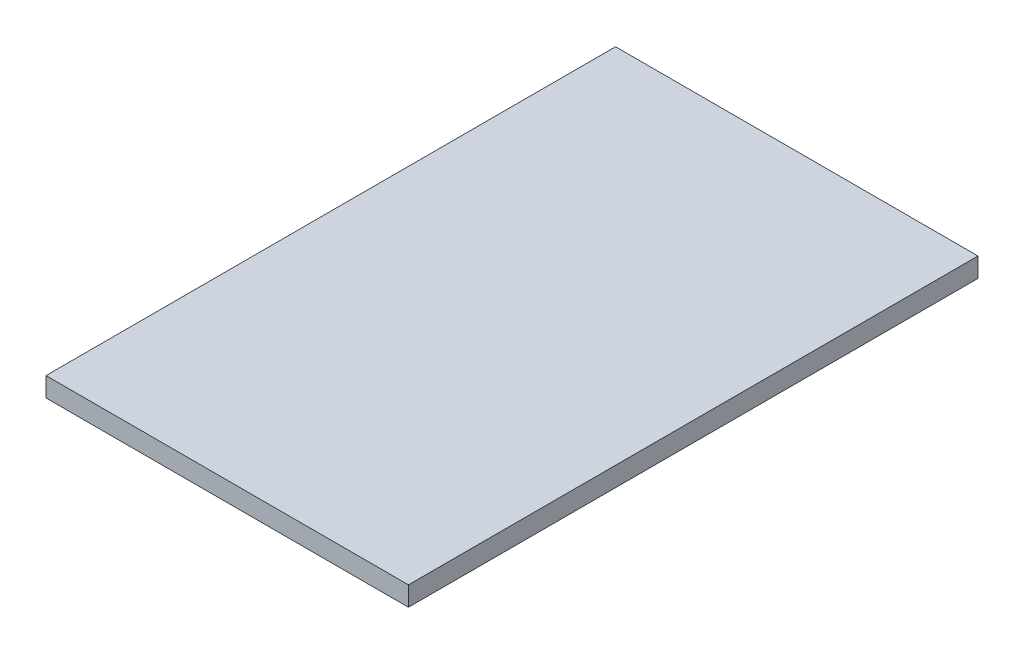
ISO-10303-21;
HEADER;
FILE_DESCRIPTION(('STEP AP214'),'2;1');
FILE_NAME('part.step','',(''),(''),'','','');
FILE_SCHEMA(('AUTOMOTIVE_DESIGN { 1 0 10303 214 1 1 1 1 }'));
ENDSEC;
DATA;
#1=APPLICATION_CONTEXT('core data for automotive mechanical design processes');
#2=APPLICATION_PROTOCOL_DEFINITION('international standard','automotive_design',2000,#1);
#3=PRODUCT_CONTEXT('',#1,'mechanical');
#4=PRODUCT('Part','Part','',(#3));
#5=PRODUCT_RELATED_PRODUCT_CATEGORY('part','',(#4));
#6=PRODUCT_DEFINITION_FORMATION('','',#4);
#7=PRODUCT_DEFINITION_CONTEXT('part definition',#1,'design');
#8=PRODUCT_DEFINITION('design','',#6,#7);
#9=PRODUCT_DEFINITION_SHAPE('','',#8);
#10=(LENGTH_UNIT() NAMED_UNIT(*) SI_UNIT(.MILLI.,.METRE.));
#11=(NAMED_UNIT(*) PLANE_ANGLE_UNIT() SI_UNIT($,.RADIAN.));
#12=(NAMED_UNIT(*) SI_UNIT($,.STERADIAN.) SOLID_ANGLE_UNIT());
#13=UNCERTAINTY_MEASURE_WITH_UNIT(LENGTH_MEASURE(1.E-05),#10,'distance_accuracy_value','');
#14=(GEOMETRIC_REPRESENTATION_CONTEXT(3) GLOBAL_UNCERTAINTY_ASSIGNED_CONTEXT((#13)) GLOBAL_UNIT_ASSIGNED_CONTEXT((#10,
#11,#12)) REPRESENTATION_CONTEXT('',''));
#15=CARTESIAN_POINT('',(0.,0.,0.));
#16=DIRECTION('',(0.,0.,1.));
#17=DIRECTION('',(1.,0.,0.));
#18=AXIS2_PLACEMENT_3D('',#15,#16,#17);
#19=CARTESIAN_POINT('',(-28.,3.,-44.));
#20=DIRECTION('',(1.,0.,0.));
#21=DIRECTION('',(0.,0.,-1.));
#22=AXIS2_PLACEMENT_3D('',#19,#20,#21);
#23=PLANE('',#22);
#24=DIRECTION('',(0.,0.,1.));
#25=VECTOR('',#24,1.);
#26=CARTESIAN_POINT('',(-28.,0.,-44.));
#27=LINE('',#26,#25);
#28=CARTESIAN_POINT('',(-28.,0.,-44.));
#29=VERTEX_POINT('',#28);
#30=CARTESIAN_POINT('',(-28.,0.,44.));
#31=VERTEX_POINT('',#30);
#32=EDGE_CURVE('E100',#29,#31,#27,.T.);
#33=ORIENTED_EDGE('',*,*,#32,.T.);
#34=DIRECTION('',(0.,-1.,0.));
#35=VECTOR('',#34,1.);
#36=CARTESIAN_POINT('',(-28.,3.,44.));
#37=LINE('',#36,#35);
#38=CARTESIAN_POINT('',(-28.,3.,44.));
#39=VERTEX_POINT('',#38);
#40=EDGE_CURVE('E11',#39,#31,#37,.T.);
#41=ORIENTED_EDGE('',*,*,#40,.F.);
#42=DIRECTION('',(0.,0.,1.));
#43=VECTOR('',#42,1.);
#44=CARTESIAN_POINT('',(-28.,3.,-44.));
#45=LINE('',#44,#43);
#46=CARTESIAN_POINT('',(-28.,3.,-44.));
#47=VERTEX_POINT('',#46);
#48=EDGE_CURVE('E88',#47,#39,#45,.T.);
#49=ORIENTED_EDGE('',*,*,#48,.F.);
#50=DIRECTION('',(0.,-1.,0.));
#51=VECTOR('',#50,1.);
#52=CARTESIAN_POINT('',(-28.,3.,-44.));
#53=LINE('',#52,#51);
#54=EDGE_CURVE('E96',#47,#29,#53,.T.);
#55=ORIENTED_EDGE('',*,*,#54,.T.);
#56=EDGE_LOOP('',(#33,#41,#49,#55));
#57=FACE_BOUND('',#56,.T.);
#58=ADVANCED_FACE('F37',(#57),#23,.F.);
#59=CARTESIAN_POINT('',(28.,3.,44.));
#60=DIRECTION('',(0.,0.,-1.));
#61=DIRECTION('',(-1.,0.,0.));
#62=AXIS2_PLACEMENT_3D('',#59,#60,#61);
#63=PLANE('',#62);
#64=DIRECTION('',(1.,0.,0.));
#65=VECTOR('',#64,1.);
#66=CARTESIAN_POINT('',(28.,0.,44.));
#67=LINE('',#66,#65);
#68=CARTESIAN_POINT('',(28.,0.,44.));
#69=VERTEX_POINT('',#68);
#70=EDGE_CURVE('E92',#31,#69,#67,.T.);
#71=ORIENTED_EDGE('',*,*,#70,.T.);
#72=DIRECTION('',(0.,-1.,0.));
#73=VECTOR('',#72,1.);
#74=CARTESIAN_POINT('',(28.,3.,44.));
#75=LINE('',#74,#73);
#76=CARTESIAN_POINT('',(28.,3.,44.));
#77=VERTEX_POINT('',#76);
#78=EDGE_CURVE('E45',#77,#69,#75,.T.);
#79=ORIENTED_EDGE('',*,*,#78,.F.);
#80=DIRECTION('',(1.,0.,0.));
#81=VECTOR('',#80,1.);
#82=CARTESIAN_POINT('',(28.,3.,44.));
#83=LINE('',#82,#81);
#84=EDGE_CURVE('E83',#39,#77,#83,.T.);
#85=ORIENTED_EDGE('',*,*,#84,.F.);
#86=ORIENTED_EDGE('',*,*,#40,.T.);
#87=EDGE_LOOP('',(#71,#79,#85,#86));
#88=FACE_BOUND('',#87,.T.);
#89=ADVANCED_FACE('F91',(#88),#63,.F.);
#90=CARTESIAN_POINT('',(28.,3.,-44.));
#91=DIRECTION('',(-1.,0.,0.));
#92=DIRECTION('',(0.,0.,1.));
#93=AXIS2_PLACEMENT_3D('',#90,#91,#92);
#94=PLANE('',#93);
#95=DIRECTION('',(0.,0.,-1.));
#96=VECTOR('',#95,1.);
#97=CARTESIAN_POINT('',(28.,0.,-44.));
#98=LINE('',#97,#96);
#99=CARTESIAN_POINT('',(28.,0.,-44.));
#100=VERTEX_POINT('',#99);
#101=EDGE_CURVE('E70',#69,#100,#98,.T.);
#102=ORIENTED_EDGE('',*,*,#101,.T.);
#103=DIRECTION('',(0.,-1.,0.));
#104=VECTOR('',#103,1.);
#105=CARTESIAN_POINT('',(28.,3.,-44.));
#106=LINE('',#105,#104);
#107=CARTESIAN_POINT('',(28.,3.,-44.));
#108=VERTEX_POINT('',#107);
#109=EDGE_CURVE('E93',#108,#100,#106,.T.);
#110=ORIENTED_EDGE('',*,*,#109,.F.);
#111=DIRECTION('',(0.,0.,-1.));
#112=VECTOR('',#111,1.);
#113=CARTESIAN_POINT('',(28.,3.,-44.));
#114=LINE('',#113,#112);
#115=EDGE_CURVE('E86',#77,#108,#114,.T.);
#116=ORIENTED_EDGE('',*,*,#115,.F.);
#117=ORIENTED_EDGE('',*,*,#78,.T.);
#118=EDGE_LOOP('',(#102,#110,#116,#117));
#119=FACE_BOUND('',#118,.T.);
#120=ADVANCED_FACE('F94',(#119),#94,.F.);
#121=CARTESIAN_POINT('',(28.,3.,-44.));
#122=DIRECTION('',(0.,0.,1.));
#123=DIRECTION('',(1.,0.,0.));
#124=AXIS2_PLACEMENT_3D('',#121,#122,#123);
#125=PLANE('',#124);
#126=DIRECTION('',(-1.,0.,0.));
#127=VECTOR('',#126,1.);
#128=CARTESIAN_POINT('',(28.,0.,-44.));
#129=LINE('',#128,#127);
#130=EDGE_CURVE('E76',#100,#29,#129,.T.);
#131=ORIENTED_EDGE('',*,*,#130,.T.);
#132=ORIENTED_EDGE('',*,*,#54,.F.);
#133=DIRECTION('',(-1.,0.,0.));
#134=VECTOR('',#133,1.);
#135=CARTESIAN_POINT('',(28.,3.,-44.));
#136=LINE('',#135,#134);
#137=EDGE_CURVE('E53',#108,#47,#136,.T.);
#138=ORIENTED_EDGE('',*,*,#137,.F.);
#139=ORIENTED_EDGE('',*,*,#109,.T.);
#140=EDGE_LOOP('',(#131,#132,#138,#139));
#141=FACE_BOUND('',#140,.T.);
#142=ADVANCED_FACE('F107',(#141),#125,.F.);
#143=CARTESIAN_POINT('',(0.,3.,0.));
#144=DIRECTION('',(0.,-1.,0.));
#145=DIRECTION('',(0.,0.,-1.));
#146=AXIS2_PLACEMENT_3D('',#143,#144,#145);
#147=PLANE('',#146);
#148=ORIENTED_EDGE('',*,*,#48,.T.);
#149=ORIENTED_EDGE('',*,*,#84,.T.);
#150=ORIENTED_EDGE('',*,*,#115,.T.);
#151=ORIENTED_EDGE('',*,*,#137,.T.);
#152=EDGE_LOOP('',(#148,#149,#150,#151));
#153=FACE_BOUND('',#152,.T.);
#154=ADVANCED_FACE('F84',(#153),#147,.F.);
#155=CARTESIAN_POINT('',(0.,0.,0.));
#156=DIRECTION('',(0.,-1.,0.));
#157=DIRECTION('',(0.,0.,-1.));
#158=AXIS2_PLACEMENT_3D('',#155,#156,#157);
#159=PLANE('',#158);
#160=ORIENTED_EDGE('',*,*,#32,.F.);
#161=ORIENTED_EDGE('',*,*,#130,.F.);
#162=ORIENTED_EDGE('',*,*,#101,.F.);
#163=ORIENTED_EDGE('',*,*,#70,.F.);
#164=EDGE_LOOP('',(#160,#161,#162,#163));
#165=FACE_BOUND('',#164,.T.);
#166=ADVANCED_FACE('F110',(#165),#159,.T.);
#167=CLOSED_SHELL('',(#58,#89,#120,#142,#154,#166));
#168=MANIFOLD_SOLID_BREP('B2',#167);
#169=ADVANCED_BREP_SHAPE_REPRESENTATION('',(#18,#168),#14);
#170=SHAPE_DEFINITION_REPRESENTATION(#9,#169);
ENDSEC;
END-ISO-10303-21;
